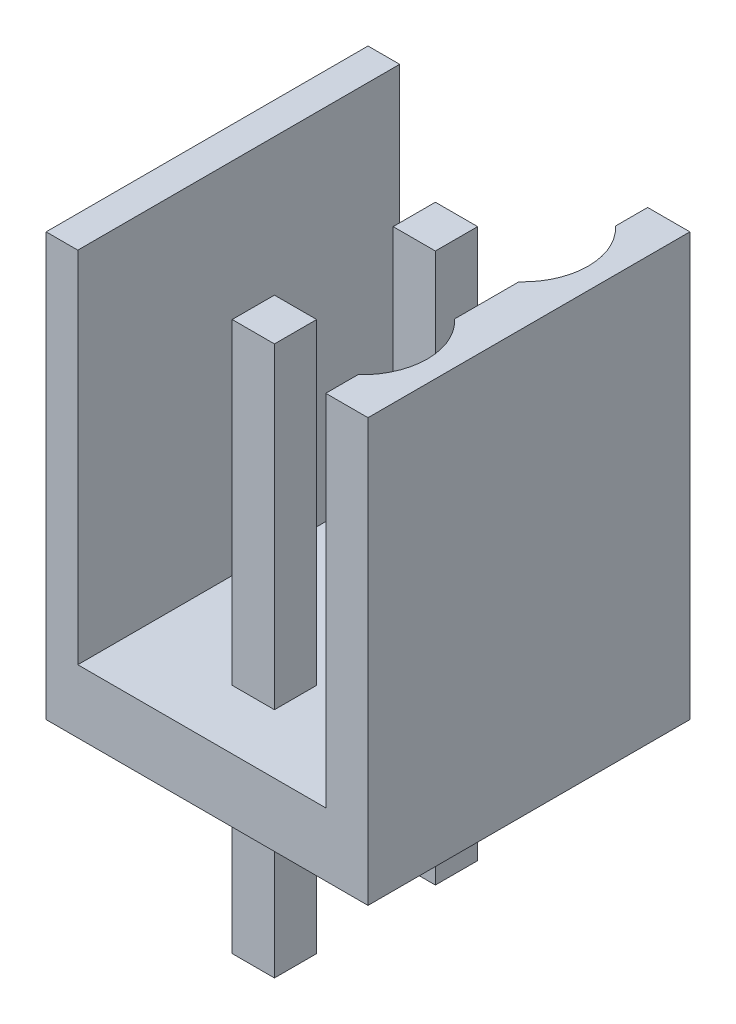
ISO-10303-21;
HEADER;
FILE_DESCRIPTION(('STEP AP214'),'2;1');
FILE_NAME('part.step','',(''),(''),'','','');
FILE_SCHEMA(('AUTOMOTIVE_DESIGN { 1 0 10303 214 1 1 1 1 }'));
ENDSEC;
DATA;
#1=APPLICATION_CONTEXT('core data for automotive mechanical design processes');
#2=APPLICATION_PROTOCOL_DEFINITION('international standard','automotive_design',2000,#1);
#3=PRODUCT_CONTEXT('',#1,'mechanical');
#4=PRODUCT('Part','Part','',(#3));
#5=PRODUCT_RELATED_PRODUCT_CATEGORY('part','',(#4));
#6=PRODUCT_DEFINITION_FORMATION('','',#4);
#7=PRODUCT_DEFINITION_CONTEXT('part definition',#1,'design');
#8=PRODUCT_DEFINITION('design','',#6,#7);
#9=PRODUCT_DEFINITION_SHAPE('','',#8);
#10=(LENGTH_UNIT() NAMED_UNIT(*) SI_UNIT(.MILLI.,.METRE.));
#11=(NAMED_UNIT(*) PLANE_ANGLE_UNIT() SI_UNIT($,.RADIAN.));
#12=(NAMED_UNIT(*) SI_UNIT($,.STERADIAN.) SOLID_ANGLE_UNIT());
#13=UNCERTAINTY_MEASURE_WITH_UNIT(LENGTH_MEASURE(1.E-05),#10,'distance_accuracy_value','');
#14=(GEOMETRIC_REPRESENTATION_CONTEXT(3) GLOBAL_UNCERTAINTY_ASSIGNED_CONTEXT((#13)) GLOBAL_UNIT_ASSIGNED_CONTEXT((#10,
#11,#12)) REPRESENTATION_CONTEXT('',''));
#15=CARTESIAN_POINT('',(0.,0.,0.));
#16=DIRECTION('',(0.,0.,1.));
#17=DIRECTION('',(1.,0.,0.));
#18=AXIS2_PLACEMENT_3D('',#15,#16,#17);
#19=CARTESIAN_POINT('',(-3.81,0.,-3.81));
#20=DIRECTION('',(0.,1.,0.));
#21=DIRECTION('',(0.,0.,1.));
#22=AXIS2_PLACEMENT_3D('',#19,#20,#21);
#23=PLANE('',#22);
#24=DIRECTION('',(0.,0.,1.));
#25=VECTOR('',#24,1.);
#26=CARTESIAN_POINT('',(0.190000000000002,0.,-3.81));
#27=LINE('',#26,#25);
#28=CARTESIAN_POINT('',(0.19,0.,1.405));
#29=VERTEX_POINT('',#28);
#30=CARTESIAN_POINT('',(0.19,0.,2.405));
#31=VERTEX_POINT('',#30);
#32=EDGE_CURVE('E321',#29,#31,#27,.T.);
#33=ORIENTED_EDGE('',*,*,#32,.F.);
#34=DIRECTION('',(1.,0.,0.));
#35=VECTOR('',#34,1.);
#36=CARTESIAN_POINT('',(-3.81,0.,1.405));
#37=LINE('',#36,#35);
#38=CARTESIAN_POINT('',(-0.81,0.,1.405));
#39=VERTEX_POINT('',#38);
#40=EDGE_CURVE('E312',#39,#29,#37,.T.);
#41=ORIENTED_EDGE('',*,*,#40,.F.);
#42=DIRECTION('',(0.,0.,-1.));
#43=VECTOR('',#42,1.);
#44=CARTESIAN_POINT('',(-0.81,0.,-3.81));
#45=LINE('',#44,#43);
#46=CARTESIAN_POINT('',(-0.81,0.,2.405));
#47=VERTEX_POINT('',#46);
#48=EDGE_CURVE('E315',#47,#39,#45,.T.);
#49=ORIENTED_EDGE('',*,*,#48,.F.);
#50=DIRECTION('',(-1.,0.,0.));
#51=VECTOR('',#50,1.);
#52=CARTESIAN_POINT('',(-3.81,0.,2.405));
#53=LINE('',#52,#51);
#54=EDGE_CURVE('E318',#31,#47,#53,.T.);
#55=ORIENTED_EDGE('',*,*,#54,.F.);
#56=EDGE_LOOP('',(#33,#41,#49,#55));
#57=FACE_BOUND('',#56,.T.);
#58=DIRECTION('',(0.,0.,1.));
#59=VECTOR('',#58,1.);
#60=CARTESIAN_POINT('',(-3.81,0.,-3.81));
#61=LINE('',#60,#59);
#62=CARTESIAN_POINT('',(-3.81,0.,-3.81));
#63=VERTEX_POINT('',#62);
#64=CARTESIAN_POINT('',(-3.81,0.,3.81));
#65=VERTEX_POINT('',#64);
#66=EDGE_CURVE('E376',#63,#65,#61,.T.);
#67=ORIENTED_EDGE('',*,*,#66,.F.);
#68=DIRECTION('',(-1.,0.,0.));
#69=VECTOR('',#68,1.);
#70=CARTESIAN_POINT('',(-3.81,0.,-3.81));
#71=LINE('',#70,#69);
#72=CARTESIAN_POINT('',(3.81,0.,-3.81));
#73=VERTEX_POINT('',#72);
#74=EDGE_CURVE('E383',#73,#63,#71,.T.);
#75=ORIENTED_EDGE('',*,*,#74,.F.);
#76=DIRECTION('',(0.,0.,-1.));
#77=VECTOR('',#76,1.);
#78=CARTESIAN_POINT('',(3.81,0.,-3.81));
#79=LINE('',#78,#77);
#80=CARTESIAN_POINT('',(3.81,0.,3.81));
#81=VERTEX_POINT('',#80);
#82=EDGE_CURVE('E381',#81,#73,#79,.T.);
#83=ORIENTED_EDGE('',*,*,#82,.F.);
#84=DIRECTION('',(1.,0.,0.));
#85=VECTOR('',#84,1.);
#86=CARTESIAN_POINT('',(-3.81,0.,3.81));
#87=LINE('',#86,#85);
#88=EDGE_CURVE('E379',#65,#81,#87,.T.);
#89=ORIENTED_EDGE('',*,*,#88,.F.);
#90=EDGE_LOOP('',(#67,#75,#83,#89));
#91=FACE_BOUND('',#90,.T.);
#92=DIRECTION('',(1.,0.,0.));
#93=VECTOR('',#92,1.);
#94=CARTESIAN_POINT('',(-3.81,0.,-2.405));
#95=LINE('',#94,#93);
#96=CARTESIAN_POINT('',(-0.81,0.,-2.405));
#97=VERTEX_POINT('',#96);
#98=CARTESIAN_POINT('',(0.19,0.,-2.405));
#99=VERTEX_POINT('',#98);
#100=EDGE_CURVE('E273',#97,#99,#95,.T.);
#101=ORIENTED_EDGE('',*,*,#100,.F.);
#102=DIRECTION('',(0.,0.,-1.));
#103=VECTOR('',#102,1.);
#104=CARTESIAN_POINT('',(-0.81,0.,-3.81));
#105=LINE('',#104,#103);
#106=CARTESIAN_POINT('',(-0.81,0.,-1.405));
#107=VERTEX_POINT('',#106);
#108=EDGE_CURVE('E268',#107,#97,#105,.T.);
#109=ORIENTED_EDGE('',*,*,#108,.F.);
#110=DIRECTION('',(-1.,0.,0.));
#111=VECTOR('',#110,1.);
#112=CARTESIAN_POINT('',(-3.81,0.,-1.405));
#113=LINE('',#112,#111);
#114=CARTESIAN_POINT('',(0.190000000000001,0.,-1.405));
#115=VERTEX_POINT('',#114);
#116=EDGE_CURVE('E54',#115,#107,#113,.T.);
#117=ORIENTED_EDGE('',*,*,#116,.F.);
#118=DIRECTION('',(0.,0.,1.));
#119=VECTOR('',#118,1.);
#120=CARTESIAN_POINT('',(0.19,0.,-3.81));
#121=LINE('',#120,#119);
#122=EDGE_CURVE('E49',#99,#115,#121,.T.);
#123=ORIENTED_EDGE('',*,*,#122,.F.);
#124=EDGE_LOOP('',(#101,#109,#117,#123));
#125=FACE_BOUND('',#124,.T.);
#126=ADVANCED_FACE('F34',(#57,#91,#125),#23,.F.);
#127=CARTESIAN_POINT('',(-3.81,1.5,-3.81));
#128=DIRECTION('',(0.,1.,0.));
#129=DIRECTION('',(0.,0.,1.));
#130=AXIS2_PLACEMENT_3D('',#127,#128,#129);
#131=PLANE('',#130);
#132=DIRECTION('',(1.,0.,0.));
#133=VECTOR('',#132,1.);
#134=CARTESIAN_POINT('',(-3.81,1.5,1.405));
#135=LINE('',#134,#133);
#136=CARTESIAN_POINT('',(-0.81,1.5,1.405));
#137=VERTEX_POINT('',#136);
#138=CARTESIAN_POINT('',(0.190000000000001,1.5,1.405));
#139=VERTEX_POINT('',#138);
#140=EDGE_CURVE('E410',#137,#139,#135,.T.);
#141=ORIENTED_EDGE('',*,*,#140,.T.);
#142=DIRECTION('',(0.,0.,1.));
#143=VECTOR('',#142,1.);
#144=CARTESIAN_POINT('',(0.190000000000002,1.5,-3.81));
#145=LINE('',#144,#143);
#146=CARTESIAN_POINT('',(0.19,1.5,2.405));
#147=VERTEX_POINT('',#146);
#148=EDGE_CURVE('E419',#139,#147,#145,.T.);
#149=ORIENTED_EDGE('',*,*,#148,.T.);
#150=DIRECTION('',(-1.,0.,0.));
#151=VECTOR('',#150,1.);
#152=CARTESIAN_POINT('',(-3.81,1.5,2.405));
#153=LINE('',#152,#151);
#154=CARTESIAN_POINT('',(-0.81,1.5,2.405));
#155=VERTEX_POINT('',#154);
#156=EDGE_CURVE('E416',#147,#155,#153,.T.);
#157=ORIENTED_EDGE('',*,*,#156,.T.);
#158=DIRECTION('',(0.,0.,-1.));
#159=VECTOR('',#158,1.);
#160=CARTESIAN_POINT('',(-0.81,1.5,-3.81));
#161=LINE('',#160,#159);
#162=EDGE_CURVE('E413',#155,#137,#161,.T.);
#163=ORIENTED_EDGE('',*,*,#162,.T.);
#164=EDGE_LOOP('',(#141,#149,#157,#163));
#165=FACE_BOUND('',#164,.T.);
#166=DIRECTION('',(1.,0.,0.));
#167=VECTOR('',#166,1.);
#168=CARTESIAN_POINT('',(2.81,1.5,-3.81));
#169=LINE('',#168,#167);
#170=CARTESIAN_POINT('',(-3.06,1.5,-3.81));
#171=VERTEX_POINT('',#170);
#172=CARTESIAN_POINT('',(2.81,1.5,-3.81));
#173=VERTEX_POINT('',#172);
#174=EDGE_CURVE('E339',#171,#173,#169,.T.);
#175=ORIENTED_EDGE('',*,*,#174,.F.);
#176=DIRECTION('',(0.,0.,-1.));
#177=VECTOR('',#176,1.);
#178=CARTESIAN_POINT('',(-3.06,1.5,-3.81));
#179=LINE('',#178,#177);
#180=CARTESIAN_POINT('',(-3.06,1.5,3.81));
#181=VERTEX_POINT('',#180);
#182=EDGE_CURVE('E342',#181,#171,#179,.T.);
#183=ORIENTED_EDGE('',*,*,#182,.F.);
#184=DIRECTION('',(-1.,0.,0.));
#185=VECTOR('',#184,1.);
#186=CARTESIAN_POINT('',(2.81,1.5,3.81));
#187=LINE('',#186,#185);
#188=CARTESIAN_POINT('',(2.81,1.5,3.81));
#189=VERTEX_POINT('',#188);
#190=EDGE_CURVE('E325',#189,#181,#187,.T.);
#191=ORIENTED_EDGE('',*,*,#190,.F.);
#192=DIRECTION('',(0.,0.,1.));
#193=VECTOR('',#192,1.);
#194=CARTESIAN_POINT('',(2.81,1.5,3.81));
#195=LINE('',#194,#193);
#196=CARTESIAN_POINT('',(2.81,1.5,3.049818304361));
#197=VERTEX_POINT('',#196);
#198=EDGE_CURVE('E328',#197,#189,#195,.T.);
#199=ORIENTED_EDGE('',*,*,#198,.F.);
#200=CARTESIAN_POINT('',(1.74939105,1.5,1.905));
#201=DIRECTION('',(0.,1.,0.));
#202=DIRECTION('',(0.,0.,1.));
#203=AXIS2_PLACEMENT_3D('',#200,#201,#202);
#204=CIRCLE('',#203,1.56060895);
#205=CARTESIAN_POINT('',(2.81,1.5,0.760181695638998));
#206=VERTEX_POINT('',#205);
#207=EDGE_CURVE('E331',#206,#197,#204,.F.);
#208=ORIENTED_EDGE('',*,*,#207,.F.);
#209=DIRECTION('',(0.,0.,1.));
#210=VECTOR('',#209,1.);
#211=CARTESIAN_POINT('',(2.81,1.5,-0.760181695638998));
#212=LINE('',#211,#210);
#213=CARTESIAN_POINT('',(2.81,1.5,-0.760181695638998));
#214=VERTEX_POINT('',#213);
#215=EDGE_CURVE('E333',#214,#206,#212,.T.);
#216=ORIENTED_EDGE('',*,*,#215,.F.);
#217=CARTESIAN_POINT('',(1.74939105,1.5,-1.905));
#218=DIRECTION('',(0.,1.,0.));
#219=DIRECTION('',(0.,0.,1.));
#220=AXIS2_PLACEMENT_3D('',#217,#218,#219);
#221=CIRCLE('',#220,1.56060895);
#222=CARTESIAN_POINT('',(2.81,1.5,-3.049818304361));
#223=VERTEX_POINT('',#222);
#224=EDGE_CURVE('E335',#223,#214,#221,.F.);
#225=ORIENTED_EDGE('',*,*,#224,.F.);
#226=DIRECTION('',(0.,0.,1.));
#227=VECTOR('',#226,1.);
#228=CARTESIAN_POINT('',(2.81,1.5,-3.81));
#229=LINE('',#228,#227);
#230=EDGE_CURVE('E337',#173,#223,#229,.T.);
#231=ORIENTED_EDGE('',*,*,#230,.F.);
#232=EDGE_LOOP('',(#175,#183,#191,#199,#208,#216,#225,#231));
#233=FACE_BOUND('',#232,.T.);
#234=DIRECTION('',(0.,0.,-1.));
#235=VECTOR('',#234,1.);
#236=CARTESIAN_POINT('',(-0.81,1.5,-3.81));
#237=LINE('',#236,#235);
#238=CARTESIAN_POINT('',(-0.81,1.5,-1.405));
#239=VERTEX_POINT('',#238);
#240=CARTESIAN_POINT('',(-0.81,1.5,-2.405));
#241=VERTEX_POINT('',#240);
#242=EDGE_CURVE('E422',#239,#241,#237,.T.);
#243=ORIENTED_EDGE('',*,*,#242,.T.);
#244=DIRECTION('',(1.,0.,0.));
#245=VECTOR('',#244,1.);
#246=CARTESIAN_POINT('',(-3.81,1.5,-2.405));
#247=LINE('',#246,#245);
#248=CARTESIAN_POINT('',(0.19,1.5,-2.405));
#249=VERTEX_POINT('',#248);
#250=EDGE_CURVE('E12',#241,#249,#247,.T.);
#251=ORIENTED_EDGE('',*,*,#250,.T.);
#252=DIRECTION('',(0.,0.,1.));
#253=VECTOR('',#252,1.);
#254=CARTESIAN_POINT('',(0.19,1.5,-3.81));
#255=LINE('',#254,#253);
#256=CARTESIAN_POINT('',(0.19,1.5,-1.405));
#257=VERTEX_POINT('',#256);
#258=EDGE_CURVE('E42',#249,#257,#255,.T.);
#259=ORIENTED_EDGE('',*,*,#258,.T.);
#260=DIRECTION('',(-1.,0.,0.));
#261=VECTOR('',#260,1.);
#262=CARTESIAN_POINT('',(-3.81,1.5,-1.405));
#263=LINE('',#262,#261);
#264=EDGE_CURVE('E223',#257,#239,#263,.T.);
#265=ORIENTED_EDGE('',*,*,#264,.T.);
#266=EDGE_LOOP('',(#243,#251,#259,#265));
#267=FACE_BOUND('',#266,.T.);
#268=ADVANCED_FACE('F426',(#165,#233,#267),#131,.T.);
#269=CARTESIAN_POINT('',(-3.81,10.,-3.81));
#270=DIRECTION('',(0.,1.,0.));
#271=DIRECTION('',(0.,0.,1.));
#272=AXIS2_PLACEMENT_3D('',#269,#270,#271);
#273=PLANE('',#272);
#274=DIRECTION('',(0.,0.,-1.));
#275=VECTOR('',#274,1.);
#276=CARTESIAN_POINT('',(2.81,10.,-3.81));
#277=LINE('',#276,#275);
#278=CARTESIAN_POINT('',(2.81,10.,-3.049818304361));
#279=VERTEX_POINT('',#278);
#280=CARTESIAN_POINT('',(2.81,10.,-3.81));
#281=VERTEX_POINT('',#280);
#282=EDGE_CURVE('E356',#279,#281,#277,.T.);
#283=ORIENTED_EDGE('',*,*,#282,.F.);
#284=CARTESIAN_POINT('',(1.74939105,10.,-1.905));
#285=DIRECTION('',(0.,1.,0.));
#286=DIRECTION('',(0.,0.,1.));
#287=AXIS2_PLACEMENT_3D('',#284,#285,#286);
#288=CIRCLE('',#287,1.56060895);
#289=CARTESIAN_POINT('',(2.81,10.,-0.760181695638998));
#290=VERTEX_POINT('',#289);
#291=EDGE_CURVE('E353',#290,#279,#288,.T.);
#292=ORIENTED_EDGE('',*,*,#291,.F.);
#293=DIRECTION('',(0.,0.,-1.));
#294=VECTOR('',#293,1.);
#295=CARTESIAN_POINT('',(2.81,10.,-0.760181695638998));
#296=LINE('',#295,#294);
#297=CARTESIAN_POINT('',(2.81,10.,0.760181695638998));
#298=VERTEX_POINT('',#297);
#299=EDGE_CURVE('E350',#298,#290,#296,.T.);
#300=ORIENTED_EDGE('',*,*,#299,.F.);
#301=CARTESIAN_POINT('',(1.74939105,10.,1.905));
#302=DIRECTION('',(0.,1.,0.));
#303=DIRECTION('',(0.,0.,-1.));
#304=AXIS2_PLACEMENT_3D('',#301,#302,#303);
#305=CIRCLE('',#304,1.56060895);
#306=CARTESIAN_POINT('',(2.81,10.,3.049818304361));
#307=VERTEX_POINT('',#306);
#308=EDGE_CURVE('E347',#307,#298,#305,.T.);
#309=ORIENTED_EDGE('',*,*,#308,.F.);
#310=DIRECTION('',(0.,0.,-1.));
#311=VECTOR('',#310,1.);
#312=CARTESIAN_POINT('',(2.81,10.,3.81));
#313=LINE('',#312,#311);
#314=CARTESIAN_POINT('',(2.81,10.,3.81));
#315=VERTEX_POINT('',#314);
#316=EDGE_CURVE('E344',#315,#307,#313,.T.);
#317=ORIENTED_EDGE('',*,*,#316,.F.);
#318=DIRECTION('',(1.,0.,0.));
#319=VECTOR('',#318,1.);
#320=CARTESIAN_POINT('',(-3.81,10.,3.81));
#321=LINE('',#320,#319);
#322=CARTESIAN_POINT('',(3.81,10.,3.81));
#323=VERTEX_POINT('',#322);
#324=EDGE_CURVE('E388',#315,#323,#321,.T.);
#325=ORIENTED_EDGE('',*,*,#324,.T.);
#326=DIRECTION('',(0.,0.,-1.));
#327=VECTOR('',#326,1.);
#328=CARTESIAN_POINT('',(3.81,10.,-3.81));
#329=LINE('',#328,#327);
#330=CARTESIAN_POINT('',(3.81,10.,-3.81));
#331=VERTEX_POINT('',#330);
#332=EDGE_CURVE('E392',#323,#331,#329,.T.);
#333=ORIENTED_EDGE('',*,*,#332,.T.);
#334=DIRECTION('',(-1.,0.,0.));
#335=VECTOR('',#334,1.);
#336=CARTESIAN_POINT('',(-3.81,10.,-3.81));
#337=LINE('',#336,#335);
#338=EDGE_CURVE('E395',#331,#281,#337,.T.);
#339=ORIENTED_EDGE('',*,*,#338,.T.);
#340=EDGE_LOOP('',(#283,#292,#300,#309,#317,#325,#333,#339));
#341=FACE_BOUND('',#340,.T.);
#342=ADVANCED_FACE('F453',(#341),#273,.T.);
#343=CARTESIAN_POINT('',(-3.81,10.,-3.81));
#344=DIRECTION('',(1.,0.,0.));
#345=DIRECTION('',(0.,0.,-1.));
#346=AXIS2_PLACEMENT_3D('',#343,#344,#345);
#347=PLANE('',#346);
#348=ORIENTED_EDGE('',*,*,#66,.T.);
#349=DIRECTION('',(0.,-1.,0.));
#350=VECTOR('',#349,1.);
#351=CARTESIAN_POINT('',(-3.81,10.,3.81));
#352=LINE('',#351,#350);
#353=CARTESIAN_POINT('',(-3.81,10.,3.81));
#354=VERTEX_POINT('',#353);
#355=EDGE_CURVE('E407',#354,#65,#352,.T.);
#356=ORIENTED_EDGE('',*,*,#355,.F.);
#357=DIRECTION('',(0.,0.,1.));
#358=VECTOR('',#357,1.);
#359=CARTESIAN_POINT('',(-3.81,10.,-3.81));
#360=LINE('',#359,#358);
#361=CARTESIAN_POINT('',(-3.81,10.,-3.81));
#362=VERTEX_POINT('',#361);
#363=EDGE_CURVE('E385',#362,#354,#360,.T.);
#364=ORIENTED_EDGE('',*,*,#363,.F.);
#365=DIRECTION('',(0.,-1.,0.));
#366=VECTOR('',#365,1.);
#367=CARTESIAN_POINT('',(-3.81,10.,-3.81));
#368=LINE('',#367,#366);
#369=EDGE_CURVE('E398',#362,#63,#368,.T.);
#370=ORIENTED_EDGE('',*,*,#369,.T.);
#371=EDGE_LOOP('',(#348,#356,#364,#370));
#372=FACE_BOUND('',#371,.T.);
#373=ADVANCED_FACE('F36',(#372),#347,.F.);
#374=CARTESIAN_POINT('',(-3.81,10.,3.81));
#375=DIRECTION('',(0.,0.,-1.));
#376=DIRECTION('',(-1.,0.,0.));
#377=AXIS2_PLACEMENT_3D('',#374,#375,#376);
#378=PLANE('',#377);
#379=ORIENTED_EDGE('',*,*,#324,.F.);
#380=DIRECTION('',(0.,1.,0.));
#381=VECTOR('',#380,1.);
#382=CARTESIAN_POINT('',(2.81,-9.93183266069259,3.81));
#383=LINE('',#382,#381);
#384=EDGE_CURVE('E369',#189,#315,#383,.T.);
#385=ORIENTED_EDGE('',*,*,#384,.F.);
#386=ORIENTED_EDGE('',*,*,#190,.T.);
#387=DIRECTION('',(0.,1.,0.));
#388=VECTOR('',#387,1.);
#389=CARTESIAN_POINT('',(-3.06,-9.93183266069259,3.81));
#390=LINE('',#389,#388);
#391=CARTESIAN_POINT('',(-3.06,10.,3.81));
#392=VERTEX_POINT('',#391);
#393=EDGE_CURVE('E371',#181,#392,#390,.T.);
#394=ORIENTED_EDGE('',*,*,#393,.T.);
#395=EDGE_CURVE('E389',#354,#392,#321,.T.);
#396=ORIENTED_EDGE('',*,*,#395,.F.);
#397=ORIENTED_EDGE('',*,*,#355,.T.);
#398=ORIENTED_EDGE('',*,*,#88,.T.);
#399=DIRECTION('',(0.,-1.,0.));
#400=VECTOR('',#399,1.);
#401=CARTESIAN_POINT('',(3.81,10.,3.81));
#402=LINE('',#401,#400);
#403=EDGE_CURVE('E404',#323,#81,#402,.T.);
#404=ORIENTED_EDGE('',*,*,#403,.F.);
#405=EDGE_LOOP('',(#379,#385,#386,#394,#396,#397,#398,#404));
#406=FACE_BOUND('',#405,.T.);
#407=ADVANCED_FACE('F472',(#406),#378,.F.);
#408=CARTESIAN_POINT('',(3.81,10.,-3.81));
#409=DIRECTION('',(-1.,0.,0.));
#410=DIRECTION('',(0.,0.,1.));
#411=AXIS2_PLACEMENT_3D('',#408,#409,#410);
#412=PLANE('',#411);
#413=ORIENTED_EDGE('',*,*,#82,.T.);
#414=DIRECTION('',(0.,-1.,0.));
#415=VECTOR('',#414,1.);
#416=CARTESIAN_POINT('',(3.81,10.,-3.81));
#417=LINE('',#416,#415);
#418=EDGE_CURVE('E401',#331,#73,#417,.T.);
#419=ORIENTED_EDGE('',*,*,#418,.F.);
#420=ORIENTED_EDGE('',*,*,#332,.F.);
#421=ORIENTED_EDGE('',*,*,#403,.T.);
#422=EDGE_LOOP('',(#413,#419,#420,#421));
#423=FACE_BOUND('',#422,.T.);
#424=ADVANCED_FACE('F469',(#423),#412,.F.);
#425=CARTESIAN_POINT('',(-3.81,10.,-3.81));
#426=DIRECTION('',(0.,0.,1.));
#427=DIRECTION('',(1.,0.,0.));
#428=AXIS2_PLACEMENT_3D('',#425,#426,#427);
#429=PLANE('',#428);
#430=ORIENTED_EDGE('',*,*,#174,.T.);
#431=DIRECTION('',(0.,1.,0.));
#432=VECTOR('',#431,1.);
#433=CARTESIAN_POINT('',(2.81,-9.93183266069259,-3.81));
#434=LINE('',#433,#432);
#435=EDGE_CURVE('E329',#173,#281,#434,.T.);
#436=ORIENTED_EDGE('',*,*,#435,.T.);
#437=ORIENTED_EDGE('',*,*,#338,.F.);
#438=ORIENTED_EDGE('',*,*,#418,.T.);
#439=ORIENTED_EDGE('',*,*,#74,.T.);
#440=ORIENTED_EDGE('',*,*,#369,.F.);
#441=CARTESIAN_POINT('',(-3.06,10.,-3.81));
#442=VERTEX_POINT('',#441);
#443=EDGE_CURVE('E394',#442,#362,#337,.T.);
#444=ORIENTED_EDGE('',*,*,#443,.F.);
#445=DIRECTION('',(0.,1.,0.));
#446=VECTOR('',#445,1.);
#447=CARTESIAN_POINT('',(-3.06,-9.93183266069259,-3.81));
#448=LINE('',#447,#446);
#449=EDGE_CURVE('E358',#171,#442,#448,.T.);
#450=ORIENTED_EDGE('',*,*,#449,.F.);
#451=EDGE_LOOP('',(#430,#436,#437,#438,#439,#440,#444,#450));
#452=FACE_BOUND('',#451,.T.);
#453=ADVANCED_FACE('F465',(#452),#429,.F.);
#454=DIRECTION('',(0.,0.,1.));
#455=VECTOR('',#454,1.);
#456=CARTESIAN_POINT('',(-3.06,10.,-3.81));
#457=LINE('',#456,#455);
#458=EDGE_CURVE('E324',#442,#392,#457,.T.);
#459=ORIENTED_EDGE('',*,*,#458,.F.);
#460=ORIENTED_EDGE('',*,*,#443,.T.);
#461=ORIENTED_EDGE('',*,*,#363,.T.);
#462=ORIENTED_EDGE('',*,*,#395,.T.);
#463=EDGE_LOOP('',(#459,#460,#461,#462));
#464=FACE_BOUND('',#463,.T.);
#465=ADVANCED_FACE('F461',(#464),#273,.T.);
#466=CARTESIAN_POINT('',(2.81,-9.93183266069259,-3.81));
#467=DIRECTION('',(1.,0.,0.));
#468=DIRECTION('',(0.,0.,-1.));
#469=AXIS2_PLACEMENT_3D('',#466,#467,#468);
#470=PLANE('',#469);
#471=ORIENTED_EDGE('',*,*,#230,.T.);
#472=DIRECTION('',(0.,1.,0.));
#473=VECTOR('',#472,1.);
#474=CARTESIAN_POINT('',(2.81,-9.93183266069259,-3.049818304361));
#475=LINE('',#474,#473);
#476=EDGE_CURVE('E361',#223,#279,#475,.T.);
#477=ORIENTED_EDGE('',*,*,#476,.T.);
#478=ORIENTED_EDGE('',*,*,#282,.T.);
#479=ORIENTED_EDGE('',*,*,#435,.F.);
#480=EDGE_LOOP('',(#471,#477,#478,#479));
#481=FACE_BOUND('',#480,.T.);
#482=ADVANCED_FACE('F464',(#481),#470,.F.);
#483=CARTESIAN_POINT('',(1.74939105,-9.93183266069259,-1.905));
#484=DIRECTION('',(0.,1.,0.));
#485=DIRECTION('',(0.,0.,1.));
#486=AXIS2_PLACEMENT_3D('',#483,#484,#485);
#487=CYLINDRICAL_SURFACE('',#486,1.56060895);
#488=ORIENTED_EDGE('',*,*,#224,.T.);
#489=DIRECTION('',(0.,1.,0.));
#490=VECTOR('',#489,1.);
#491=CARTESIAN_POINT('',(2.81,-9.93183266069259,-0.760181695638998));
#492=LINE('',#491,#490);
#493=EDGE_CURVE('E363',#214,#290,#492,.T.);
#494=ORIENTED_EDGE('',*,*,#493,.T.);
#495=ORIENTED_EDGE('',*,*,#291,.T.);
#496=ORIENTED_EDGE('',*,*,#476,.F.);
#497=EDGE_LOOP('',(#488,#494,#495,#496));
#498=FACE_BOUND('',#497,.T.);
#499=ADVANCED_FACE('F515',(#498),#487,.F.);
#500=CARTESIAN_POINT('',(2.81,-9.93183266069259,-0.760181695638998));
#501=DIRECTION('',(1.,0.,0.));
#502=DIRECTION('',(0.,0.,-1.));
#503=AXIS2_PLACEMENT_3D('',#500,#501,#502);
#504=PLANE('',#503);
#505=ORIENTED_EDGE('',*,*,#215,.T.);
#506=DIRECTION('',(0.,1.,0.));
#507=VECTOR('',#506,1.);
#508=CARTESIAN_POINT('',(2.81,-9.93183266069259,0.760181695638998));
#509=LINE('',#508,#507);
#510=EDGE_CURVE('E365',#206,#298,#509,.T.);
#511=ORIENTED_EDGE('',*,*,#510,.T.);
#512=ORIENTED_EDGE('',*,*,#299,.T.);
#513=ORIENTED_EDGE('',*,*,#493,.F.);
#514=EDGE_LOOP('',(#505,#511,#512,#513));
#515=FACE_BOUND('',#514,.T.);
#516=ADVANCED_FACE('F519',(#515),#504,.F.);
#517=CARTESIAN_POINT('',(1.74939105,-9.93183266069259,1.905));
#518=DIRECTION('',(0.,1.,0.));
#519=DIRECTION('',(0.,0.,1.));
#520=AXIS2_PLACEMENT_3D('',#517,#518,#519);
#521=CYLINDRICAL_SURFACE('',#520,1.56060895);
#522=ORIENTED_EDGE('',*,*,#207,.T.);
#523=DIRECTION('',(0.,1.,0.));
#524=VECTOR('',#523,1.);
#525=CARTESIAN_POINT('',(2.81,-9.93183266069259,3.049818304361));
#526=LINE('',#525,#524);
#527=EDGE_CURVE('E367',#197,#307,#526,.T.);
#528=ORIENTED_EDGE('',*,*,#527,.T.);
#529=ORIENTED_EDGE('',*,*,#308,.T.);
#530=ORIENTED_EDGE('',*,*,#510,.F.);
#531=EDGE_LOOP('',(#522,#528,#529,#530));
#532=FACE_BOUND('',#531,.T.);
#533=ADVANCED_FACE('F522',(#532),#521,.F.);
#534=CARTESIAN_POINT('',(2.81,-9.93183266069259,3.81));
#535=DIRECTION('',(1.,0.,0.));
#536=DIRECTION('',(0.,0.,-1.));
#537=AXIS2_PLACEMENT_3D('',#534,#535,#536);
#538=PLANE('',#537);
#539=ORIENTED_EDGE('',*,*,#198,.T.);
#540=ORIENTED_EDGE('',*,*,#384,.T.);
#541=ORIENTED_EDGE('',*,*,#316,.T.);
#542=ORIENTED_EDGE('',*,*,#527,.F.);
#543=EDGE_LOOP('',(#539,#540,#541,#542));
#544=FACE_BOUND('',#543,.T.);
#545=ADVANCED_FACE('F492',(#544),#538,.F.);
#546=CARTESIAN_POINT('',(-3.06,-9.93183266069259,-3.81));
#547=DIRECTION('',(-1.,0.,0.));
#548=DIRECTION('',(0.,0.,1.));
#549=AXIS2_PLACEMENT_3D('',#546,#547,#548);
#550=PLANE('',#549);
#551=ORIENTED_EDGE('',*,*,#182,.T.);
#552=ORIENTED_EDGE('',*,*,#449,.T.);
#553=ORIENTED_EDGE('',*,*,#458,.T.);
#554=ORIENTED_EDGE('',*,*,#393,.F.);
#555=EDGE_LOOP('',(#551,#552,#553,#554));
#556=FACE_BOUND('',#555,.T.);
#557=ADVANCED_FACE('F459',(#556),#550,.F.);
#558=CARTESIAN_POINT('',(-3.81,9.,-3.81));
#559=DIRECTION('',(0.,1.,0.));
#560=DIRECTION('',(0.,0.,1.));
#561=AXIS2_PLACEMENT_3D('',#558,#559,#560);
#562=PLANE('',#561);
#563=DIRECTION('',(0.,0.,1.));
#564=VECTOR('',#563,1.);
#565=CARTESIAN_POINT('',(0.19,9.,2.405));
#566=LINE('',#565,#564);
#567=CARTESIAN_POINT('',(0.19,9.,1.405));
#568=VERTEX_POINT('',#567);
#569=CARTESIAN_POINT('',(0.19,9.,2.405));
#570=VERTEX_POINT('',#569);
#571=EDGE_CURVE('E279',#568,#570,#566,.T.);
#572=ORIENTED_EDGE('',*,*,#571,.F.);
#573=DIRECTION('',(1.,0.,0.));
#574=VECTOR('',#573,1.);
#575=CARTESIAN_POINT('',(0.19,9.,1.405));
#576=LINE('',#575,#574);
#577=CARTESIAN_POINT('',(-0.81,9.,1.405));
#578=VERTEX_POINT('',#577);
#579=EDGE_CURVE('E283',#578,#568,#576,.T.);
#580=ORIENTED_EDGE('',*,*,#579,.F.);
#581=DIRECTION('',(0.,0.,-1.));
#582=VECTOR('',#581,1.);
#583=CARTESIAN_POINT('',(-0.81,9.,2.405));
#584=LINE('',#583,#582);
#585=CARTESIAN_POINT('',(-0.81,9.,2.405));
#586=VERTEX_POINT('',#585);
#587=EDGE_CURVE('E278',#586,#578,#584,.T.);
#588=ORIENTED_EDGE('',*,*,#587,.F.);
#589=DIRECTION('',(-1.,0.,0.));
#590=VECTOR('',#589,1.);
#591=CARTESIAN_POINT('',(0.19,9.,2.405));
#592=LINE('',#591,#590);
#593=EDGE_CURVE('E275',#570,#586,#592,.T.);
#594=ORIENTED_EDGE('',*,*,#593,.F.);
#595=EDGE_LOOP('',(#572,#580,#588,#594));
#596=FACE_BOUND('',#595,.T.);
#597=ADVANCED_FACE('F525',(#596),#562,.T.);
#598=CARTESIAN_POINT('',(0.19,-4.,1.405));
#599=DIRECTION('',(0.,0.,1.));
#600=DIRECTION('',(1.,0.,0.));
#601=AXIS2_PLACEMENT_3D('',#598,#599,#600);
#602=PLANE('',#601);
#603=ORIENTED_EDGE('',*,*,#140,.F.);
#604=DIRECTION('',(0.,1.,0.));
#605=VECTOR('',#604,1.);
#606=CARTESIAN_POINT('',(-0.81,-4.,1.405));
#607=LINE('',#606,#605);
#608=EDGE_CURVE('E300',#137,#578,#607,.T.);
#609=ORIENTED_EDGE('',*,*,#608,.T.);
#610=ORIENTED_EDGE('',*,*,#579,.T.);
#611=DIRECTION('',(0.,1.,0.));
#612=VECTOR('',#611,1.);
#613=CARTESIAN_POINT('',(0.19,-4.,1.405));
#614=LINE('',#613,#612);
#615=EDGE_CURVE('E296',#139,#568,#614,.T.);
#616=ORIENTED_EDGE('',*,*,#615,.F.);
#617=EDGE_LOOP('',(#603,#609,#610,#616));
#618=FACE_BOUND('',#617,.T.);
#619=ADVANCED_FACE('F530',(#618),#602,.F.);
#620=CARTESIAN_POINT('',(-0.81,-4.,2.405));
#621=DIRECTION('',(1.,0.,0.));
#622=DIRECTION('',(0.,0.,-1.));
#623=AXIS2_PLACEMENT_3D('',#620,#621,#622);
#624=PLANE('',#623);
#625=ORIENTED_EDGE('',*,*,#162,.F.);
#626=DIRECTION('',(0.,1.,0.));
#627=VECTOR('',#626,1.);
#628=CARTESIAN_POINT('',(-0.81,-4.,2.405));
#629=LINE('',#628,#627);
#630=EDGE_CURVE('E304',#155,#586,#629,.T.);
#631=ORIENTED_EDGE('',*,*,#630,.T.);
#632=ORIENTED_EDGE('',*,*,#587,.T.);
#633=ORIENTED_EDGE('',*,*,#608,.F.);
#634=EDGE_LOOP('',(#625,#631,#632,#633));
#635=FACE_BOUND('',#634,.T.);
#636=ADVANCED_FACE('F552',(#635),#624,.F.);
#637=CARTESIAN_POINT('',(0.19,-4.,2.405));
#638=DIRECTION('',(0.,0.,-1.));
#639=DIRECTION('',(-1.,0.,0.));
#640=AXIS2_PLACEMENT_3D('',#637,#638,#639);
#641=PLANE('',#640);
#642=ORIENTED_EDGE('',*,*,#156,.F.);
#643=DIRECTION('',(0.,1.,0.));
#644=VECTOR('',#643,1.);
#645=CARTESIAN_POINT('',(0.19,-4.,2.405));
#646=LINE('',#645,#644);
#647=EDGE_CURVE('E308',#147,#570,#646,.T.);
#648=ORIENTED_EDGE('',*,*,#647,.T.);
#649=ORIENTED_EDGE('',*,*,#593,.T.);
#650=ORIENTED_EDGE('',*,*,#630,.F.);
#651=EDGE_LOOP('',(#642,#648,#649,#650));
#652=FACE_BOUND('',#651,.T.);
#653=ADVANCED_FACE('F548',(#652),#641,.F.);
#654=CARTESIAN_POINT('',(0.19,-4.,2.405));
#655=DIRECTION('',(-1.,0.,0.));
#656=DIRECTION('',(0.,0.,1.));
#657=AXIS2_PLACEMENT_3D('',#654,#655,#656);
#658=PLANE('',#657);
#659=ORIENTED_EDGE('',*,*,#148,.F.);
#660=ORIENTED_EDGE('',*,*,#615,.T.);
#661=ORIENTED_EDGE('',*,*,#571,.T.);
#662=ORIENTED_EDGE('',*,*,#647,.F.);
#663=EDGE_LOOP('',(#659,#660,#661,#662));
#664=FACE_BOUND('',#663,.T.);
#665=ADVANCED_FACE('F544',(#664),#658,.F.);
#666=CARTESIAN_POINT('',(0.19,-4.,1.405));
#667=VERTEX_POINT('',#666);
#668=EDGE_CURVE('E297',#667,#29,#614,.T.);
#669=ORIENTED_EDGE('',*,*,#668,.T.);
#670=ORIENTED_EDGE('',*,*,#32,.T.);
#671=CARTESIAN_POINT('',(0.19,-4.,2.405));
#672=VERTEX_POINT('',#671);
#673=EDGE_CURVE('E309',#672,#31,#646,.T.);
#674=ORIENTED_EDGE('',*,*,#673,.F.);
#675=DIRECTION('',(0.,0.,1.));
#676=VECTOR('',#675,1.);
#677=CARTESIAN_POINT('',(0.19,-4.,2.405));
#678=LINE('',#677,#676);
#679=EDGE_CURVE('E282',#667,#672,#678,.T.);
#680=ORIENTED_EDGE('',*,*,#679,.F.);
#681=EDGE_LOOP('',(#669,#670,#674,#680));
#682=FACE_BOUND('',#681,.T.);
#683=ADVANCED_FACE('F547',(#682),#658,.F.);
#684=ORIENTED_EDGE('',*,*,#673,.T.);
#685=ORIENTED_EDGE('',*,*,#54,.T.);
#686=CARTESIAN_POINT('',(-0.81,-4.,2.405));
#687=VERTEX_POINT('',#686);
#688=EDGE_CURVE('E305',#687,#47,#629,.T.);
#689=ORIENTED_EDGE('',*,*,#688,.F.);
#690=DIRECTION('',(-1.,0.,0.));
#691=VECTOR('',#690,1.);
#692=CARTESIAN_POINT('',(0.19,-4.,2.405));
#693=LINE('',#692,#691);
#694=EDGE_CURVE('E290',#672,#687,#693,.T.);
#695=ORIENTED_EDGE('',*,*,#694,.F.);
#696=EDGE_LOOP('',(#684,#685,#689,#695));
#697=FACE_BOUND('',#696,.T.);
#698=ADVANCED_FACE('F554',(#697),#641,.F.);
#699=ORIENTED_EDGE('',*,*,#688,.T.);
#700=ORIENTED_EDGE('',*,*,#48,.T.);
#701=CARTESIAN_POINT('',(-0.81,-4.,1.405));
#702=VERTEX_POINT('',#701);
#703=EDGE_CURVE('E301',#702,#39,#607,.T.);
#704=ORIENTED_EDGE('',*,*,#703,.F.);
#705=DIRECTION('',(0.,0.,-1.));
#706=VECTOR('',#705,1.);
#707=CARTESIAN_POINT('',(-0.81,-4.,2.405));
#708=LINE('',#707,#706);
#709=EDGE_CURVE('E292',#687,#702,#708,.T.);
#710=ORIENTED_EDGE('',*,*,#709,.F.);
#711=EDGE_LOOP('',(#699,#700,#704,#710));
#712=FACE_BOUND('',#711,.T.);
#713=ADVANCED_FACE('F558',(#712),#624,.F.);
#714=ORIENTED_EDGE('',*,*,#703,.T.);
#715=ORIENTED_EDGE('',*,*,#40,.T.);
#716=ORIENTED_EDGE('',*,*,#668,.F.);
#717=DIRECTION('',(1.,0.,0.));
#718=VECTOR('',#717,1.);
#719=CARTESIAN_POINT('',(0.19,-4.,1.405));
#720=LINE('',#719,#718);
#721=EDGE_CURVE('E294',#702,#667,#720,.T.);
#722=ORIENTED_EDGE('',*,*,#721,.F.);
#723=EDGE_LOOP('',(#714,#715,#716,#722));
#724=FACE_BOUND('',#723,.T.);
#725=ADVANCED_FACE('F562',(#724),#602,.F.);
#726=CARTESIAN_POINT('',(0.19,-4.,1.405));
#727=DIRECTION('',(0.,1.,0.));
#728=DIRECTION('',(0.,0.,1.));
#729=AXIS2_PLACEMENT_3D('',#726,#727,#728);
#730=PLANE('',#729);
#731=ORIENTED_EDGE('',*,*,#679,.T.);
#732=ORIENTED_EDGE('',*,*,#694,.T.);
#733=ORIENTED_EDGE('',*,*,#709,.T.);
#734=ORIENTED_EDGE('',*,*,#721,.T.);
#735=EDGE_LOOP('',(#731,#732,#733,#734));
#736=FACE_BOUND('',#735,.T.);
#737=ADVANCED_FACE('F441',(#736),#730,.F.);
#738=CARTESIAN_POINT('',(-3.81,9.,-3.81));
#739=DIRECTION('',(0.,1.,0.));
#740=DIRECTION('',(0.,0.,1.));
#741=AXIS2_PLACEMENT_3D('',#738,#739,#740);
#742=PLANE('',#741);
#743=DIRECTION('',(1.,0.,0.));
#744=VECTOR('',#743,1.);
#745=CARTESIAN_POINT('',(0.19,9.,-2.405));
#746=LINE('',#745,#744);
#747=CARTESIAN_POINT('',(-0.81,9.,-2.405));
#748=VERTEX_POINT('',#747);
#749=CARTESIAN_POINT('',(0.19,9.,-2.405));
#750=VERTEX_POINT('',#749);
#751=EDGE_CURVE('E245',#748,#750,#746,.T.);
#752=ORIENTED_EDGE('',*,*,#751,.F.);
#753=DIRECTION('',(0.,0.,-1.));
#754=VECTOR('',#753,1.);
#755=CARTESIAN_POINT('',(-0.81,9.,-2.405));
#756=LINE('',#755,#754);
#757=CARTESIAN_POINT('',(-0.81,9.,-1.405));
#758=VERTEX_POINT('',#757);
#759=EDGE_CURVE('E238',#758,#748,#756,.T.);
#760=ORIENTED_EDGE('',*,*,#759,.F.);
#761=DIRECTION('',(-1.,0.,0.));
#762=VECTOR('',#761,1.);
#763=CARTESIAN_POINT('',(0.19,9.,-1.405));
#764=LINE('',#763,#762);
#765=CARTESIAN_POINT('',(0.19,9.,-1.405));
#766=VERTEX_POINT('',#765);
#767=EDGE_CURVE('E221',#766,#758,#764,.T.);
#768=ORIENTED_EDGE('',*,*,#767,.F.);
#769=DIRECTION('',(0.,0.,1.));
#770=VECTOR('',#769,1.);
#771=CARTESIAN_POINT('',(0.19,9.,-2.405));
#772=LINE('',#771,#770);
#773=EDGE_CURVE('E235',#750,#766,#772,.T.);
#774=ORIENTED_EDGE('',*,*,#773,.F.);
#775=EDGE_LOOP('',(#752,#760,#768,#774));
#776=FACE_BOUND('',#775,.T.);
#777=ADVANCED_FACE('F234',(#776),#742,.T.);
#778=CARTESIAN_POINT('',(-0.81,-4.,-2.405));
#779=DIRECTION('',(1.,0.,0.));
#780=DIRECTION('',(0.,0.,-1.));
#781=AXIS2_PLACEMENT_3D('',#778,#779,#780);
#782=PLANE('',#781);
#783=ORIENTED_EDGE('',*,*,#242,.F.);
#784=DIRECTION('',(0.,1.,0.));
#785=VECTOR('',#784,1.);
#786=CARTESIAN_POINT('',(-0.81,-4.,-1.405));
#787=LINE('',#786,#785);
#788=EDGE_CURVE('E261',#239,#758,#787,.T.);
#789=ORIENTED_EDGE('',*,*,#788,.T.);
#790=ORIENTED_EDGE('',*,*,#759,.T.);
#791=DIRECTION('',(0.,1.,0.));
#792=VECTOR('',#791,1.);
#793=CARTESIAN_POINT('',(-0.81,-4.,-2.405));
#794=LINE('',#793,#792);
#795=EDGE_CURVE('E257',#241,#748,#794,.T.);
#796=ORIENTED_EDGE('',*,*,#795,.F.);
#797=EDGE_LOOP('',(#783,#789,#790,#796));
#798=FACE_BOUND('',#797,.T.);
#799=ADVANCED_FACE('F431',(#798),#782,.F.);
#800=CARTESIAN_POINT('',(0.19,-4.,-1.405));
#801=DIRECTION('',(0.,0.,-1.));
#802=DIRECTION('',(-1.,0.,0.));
#803=AXIS2_PLACEMENT_3D('',#800,#801,#802);
#804=PLANE('',#803);
#805=ORIENTED_EDGE('',*,*,#264,.F.);
#806=DIRECTION('',(0.,1.,0.));
#807=VECTOR('',#806,1.);
#808=CARTESIAN_POINT('',(0.19,-4.,-1.405));
#809=LINE('',#808,#807);
#810=EDGE_CURVE('E217',#257,#766,#809,.T.);
#811=ORIENTED_EDGE('',*,*,#810,.T.);
#812=ORIENTED_EDGE('',*,*,#767,.T.);
#813=ORIENTED_EDGE('',*,*,#788,.F.);
#814=EDGE_LOOP('',(#805,#811,#812,#813));
#815=FACE_BOUND('',#814,.T.);
#816=ADVANCED_FACE('F219',(#815),#804,.F.);
#817=CARTESIAN_POINT('',(0.19,-4.,-2.405));
#818=DIRECTION('',(-1.,0.,0.));
#819=DIRECTION('',(0.,0.,1.));
#820=AXIS2_PLACEMENT_3D('',#817,#818,#819);
#821=PLANE('',#820);
#822=ORIENTED_EDGE('',*,*,#258,.F.);
#823=DIRECTION('',(0.,1.,0.));
#824=VECTOR('',#823,1.);
#825=CARTESIAN_POINT('',(0.19,-4.,-2.405));
#826=LINE('',#825,#824);
#827=EDGE_CURVE('E242',#249,#750,#826,.T.);
#828=ORIENTED_EDGE('',*,*,#827,.T.);
#829=ORIENTED_EDGE('',*,*,#773,.T.);
#830=ORIENTED_EDGE('',*,*,#810,.F.);
#831=EDGE_LOOP('',(#822,#828,#829,#830));
#832=FACE_BOUND('',#831,.T.);
#833=ADVANCED_FACE('F240',(#832),#821,.F.);
#834=CARTESIAN_POINT('',(0.19,-4.,-2.405));
#835=DIRECTION('',(0.,0.,1.));
#836=DIRECTION('',(1.,0.,0.));
#837=AXIS2_PLACEMENT_3D('',#834,#835,#836);
#838=PLANE('',#837);
#839=ORIENTED_EDGE('',*,*,#250,.F.);
#840=ORIENTED_EDGE('',*,*,#795,.T.);
#841=ORIENTED_EDGE('',*,*,#751,.T.);
#842=ORIENTED_EDGE('',*,*,#827,.F.);
#843=EDGE_LOOP('',(#839,#840,#841,#842));
#844=FACE_BOUND('',#843,.T.);
#845=ADVANCED_FACE('F429',(#844),#838,.F.);
#846=CARTESIAN_POINT('',(-0.81,-4.,-2.405));
#847=VERTEX_POINT('',#846);
#848=EDGE_CURVE('E258',#847,#97,#794,.T.);
#849=ORIENTED_EDGE('',*,*,#848,.T.);
#850=ORIENTED_EDGE('',*,*,#100,.T.);
#851=CARTESIAN_POINT('',(0.19,-4.,-2.405));
#852=VERTEX_POINT('',#851);
#853=EDGE_CURVE('E265',#852,#99,#826,.T.);
#854=ORIENTED_EDGE('',*,*,#853,.F.);
#855=DIRECTION('',(1.,0.,0.));
#856=VECTOR('',#855,1.);
#857=CARTESIAN_POINT('',(0.19,-4.,-2.405));
#858=LINE('',#857,#856);
#859=EDGE_CURVE('E247',#847,#852,#858,.T.);
#860=ORIENTED_EDGE('',*,*,#859,.F.);
#861=EDGE_LOOP('',(#849,#850,#854,#860));
#862=FACE_BOUND('',#861,.T.);
#863=ADVANCED_FACE('F568',(#862),#838,.F.);
#864=ORIENTED_EDGE('',*,*,#853,.T.);
#865=ORIENTED_EDGE('',*,*,#122,.T.);
#866=CARTESIAN_POINT('',(0.19,-4.,-1.405));
#867=VERTEX_POINT('',#866);
#868=EDGE_CURVE('E227',#867,#115,#809,.T.);
#869=ORIENTED_EDGE('',*,*,#868,.F.);
#870=DIRECTION('',(0.,0.,1.));
#871=VECTOR('',#870,1.);
#872=CARTESIAN_POINT('',(0.19,-4.,-2.405));
#873=LINE('',#872,#871);
#874=EDGE_CURVE('E251',#852,#867,#873,.T.);
#875=ORIENTED_EDGE('',*,*,#874,.F.);
#876=EDGE_LOOP('',(#864,#865,#869,#875));
#877=FACE_BOUND('',#876,.T.);
#878=ADVANCED_FACE('F570',(#877),#821,.F.);
#879=ORIENTED_EDGE('',*,*,#868,.T.);
#880=ORIENTED_EDGE('',*,*,#116,.T.);
#881=CARTESIAN_POINT('',(-0.81,-4.,-1.405));
#882=VERTEX_POINT('',#881);
#883=EDGE_CURVE('E228',#882,#107,#787,.T.);
#884=ORIENTED_EDGE('',*,*,#883,.F.);
#885=DIRECTION('',(-1.,0.,0.));
#886=VECTOR('',#885,1.);
#887=CARTESIAN_POINT('',(0.19,-4.,-1.405));
#888=LINE('',#887,#886);
#889=EDGE_CURVE('E253',#867,#882,#888,.T.);
#890=ORIENTED_EDGE('',*,*,#889,.F.);
#891=EDGE_LOOP('',(#879,#880,#884,#890));
#892=FACE_BOUND('',#891,.T.);
#893=ADVANCED_FACE('F440',(#892),#804,.F.);
#894=ORIENTED_EDGE('',*,*,#883,.T.);
#895=ORIENTED_EDGE('',*,*,#108,.T.);
#896=ORIENTED_EDGE('',*,*,#848,.F.);
#897=DIRECTION('',(0.,0.,-1.));
#898=VECTOR('',#897,1.);
#899=CARTESIAN_POINT('',(-0.81,-4.,-2.405));
#900=LINE('',#899,#898);
#901=EDGE_CURVE('E255',#882,#847,#900,.T.);
#902=ORIENTED_EDGE('',*,*,#901,.F.);
#903=EDGE_LOOP('',(#894,#895,#896,#902));
#904=FACE_BOUND('',#903,.T.);
#905=ADVANCED_FACE('F434',(#904),#782,.F.);
#906=CARTESIAN_POINT('',(-0.81,-4.,-2.405));
#907=DIRECTION('',(0.,1.,0.));
#908=DIRECTION('',(0.,0.,1.));
#909=AXIS2_PLACEMENT_3D('',#906,#907,#908);
#910=PLANE('',#909);
#911=ORIENTED_EDGE('',*,*,#859,.T.);
#912=ORIENTED_EDGE('',*,*,#874,.T.);
#913=ORIENTED_EDGE('',*,*,#889,.T.);
#914=ORIENTED_EDGE('',*,*,#901,.T.);
#915=EDGE_LOOP('',(#911,#912,#913,#914));
#916=FACE_BOUND('',#915,.T.);
#917=ADVANCED_FACE('F445',(#916),#910,.F.);
#918=CLOSED_SHELL('',(#126,#268,#342,#373,#407,#424,#453,#465,#482,#499,#516,#533,#545,#557,
#597,#619,#636,#653,#665,#683,#698,#713,#725,#737,#777,#799,#816,#833,#845,#863,#878,#893,#905,#917));
#919=MANIFOLD_SOLID_BREP('B2',#918);
#920=ADVANCED_BREP_SHAPE_REPRESENTATION('',(#18,#919),#14);
#921=SHAPE_DEFINITION_REPRESENTATION(#9,#920);
ENDSEC;
END-ISO-10303-21;
